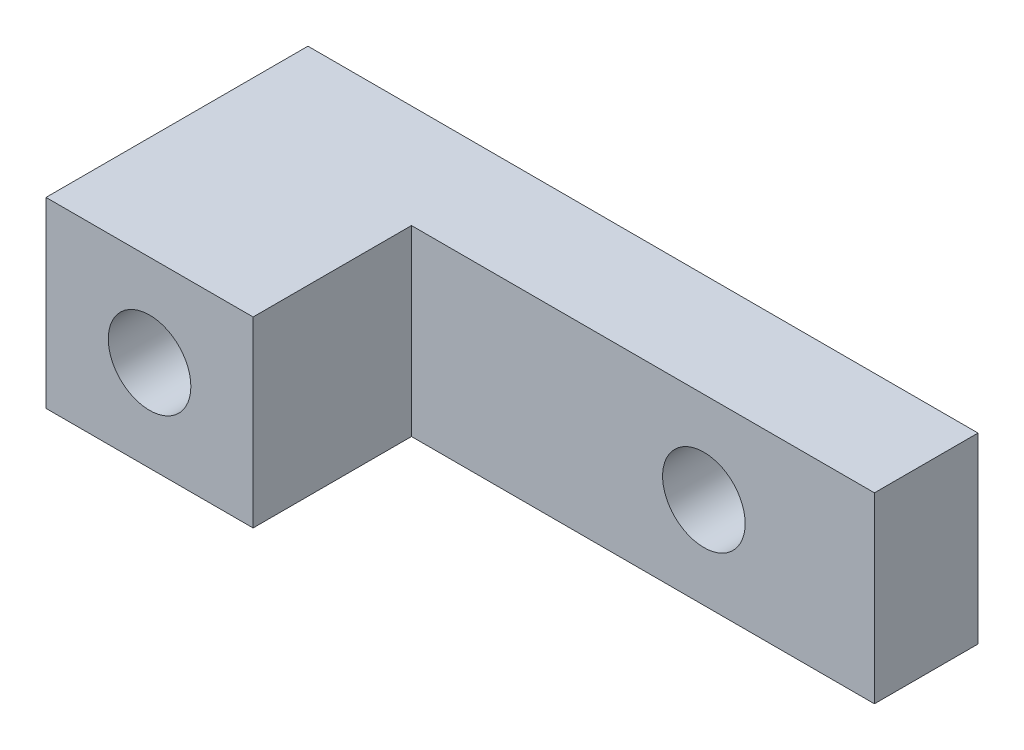
ISO-10303-21;
HEADER;
FILE_DESCRIPTION(('STEP AP214'),'2;1');
FILE_NAME('part.step','',(''),(''),'','','');
FILE_SCHEMA(('AUTOMOTIVE_DESIGN { 1 0 10303 214 1 1 1 1 }'));
ENDSEC;
DATA;
#1=APPLICATION_CONTEXT('core data for automotive mechanical design processes');
#2=APPLICATION_PROTOCOL_DEFINITION('international standard','automotive_design',2000,#1);
#3=PRODUCT_CONTEXT('',#1,'mechanical');
#4=PRODUCT('Part','Part','',(#3));
#5=PRODUCT_RELATED_PRODUCT_CATEGORY('part','',(#4));
#6=PRODUCT_DEFINITION_FORMATION('','',#4);
#7=PRODUCT_DEFINITION_CONTEXT('part definition',#1,'design');
#8=PRODUCT_DEFINITION('design','',#6,#7);
#9=PRODUCT_DEFINITION_SHAPE('','',#8);
#10=(LENGTH_UNIT() NAMED_UNIT(*) SI_UNIT(.MILLI.,.METRE.));
#11=(NAMED_UNIT(*) PLANE_ANGLE_UNIT() SI_UNIT($,.RADIAN.));
#12=(NAMED_UNIT(*) SI_UNIT($,.STERADIAN.) SOLID_ANGLE_UNIT());
#13=UNCERTAINTY_MEASURE_WITH_UNIT(LENGTH_MEASURE(1.E-05),#10,'distance_accuracy_value','');
#14=(GEOMETRIC_REPRESENTATION_CONTEXT(3) GLOBAL_UNCERTAINTY_ASSIGNED_CONTEXT((#13)) GLOBAL_UNIT_ASSIGNED_CONTEXT((#10,
#11,#12)) REPRESENTATION_CONTEXT('',''));
#15=CARTESIAN_POINT('',(0.,0.,0.));
#16=DIRECTION('',(0.,0.,1.));
#17=DIRECTION('',(1.,0.,0.));
#18=AXIS2_PLACEMENT_3D('',#15,#16,#17);
#19=CARTESIAN_POINT('',(-10.795,4.7625,0.));
#20=DIRECTION('',(0.,0.,-1.));
#21=DIRECTION('',(-1.,0.,0.));
#22=AXIS2_PLACEMENT_3D('',#19,#20,#21);
#23=PLANE('',#22);
#24=CARTESIAN_POINT('',(-5.3975,0.,0.));
#25=DIRECTION('',(0.,0.,1.));
#26=DIRECTION('',(1.,0.,0.));
#27=AXIS2_PLACEMENT_3D('',#24,#25,#26);
#28=CIRCLE('',#27,2.15265);
#29=CARTESIAN_POINT('',(-3.24485,0.,0.));
#30=VERTEX_POINT('',#29);
#31=EDGE_CURVE('E162',#30,#30,#28,.T.);
#32=ORIENTED_EDGE('',*,*,#31,.F.);
#33=EDGE_LOOP('',(#32));
#34=FACE_BOUND('',#33,.T.);
#35=DIRECTION('',(1.,0.,0.));
#36=VECTOR('',#35,1.);
#37=CARTESIAN_POINT('',(-10.795,-4.7625,0.));
#38=LINE('',#37,#36);
#39=CARTESIAN_POINT('',(-10.795,-4.7625,0.));
#40=VERTEX_POINT('',#39);
#41=CARTESIAN_POINT('',(0.,-4.7625,0.));
#42=VERTEX_POINT('',#41);
#43=EDGE_CURVE('E119',#40,#42,#38,.T.);
#44=ORIENTED_EDGE('',*,*,#43,.T.);
#45=DIRECTION('',(0.,-1.,0.));
#46=VECTOR('',#45,1.);
#47=CARTESIAN_POINT('',(0.,4.7625,0.));
#48=LINE('',#47,#46);
#49=CARTESIAN_POINT('',(0.,4.7625,0.));
#50=VERTEX_POINT('',#49);
#51=EDGE_CURVE('E11',#50,#42,#48,.T.);
#52=ORIENTED_EDGE('',*,*,#51,.F.);
#53=DIRECTION('',(1.,0.,0.));
#54=VECTOR('',#53,1.);
#55=CARTESIAN_POINT('',(-10.795,4.7625,0.));
#56=LINE('',#55,#54);
#57=CARTESIAN_POINT('',(-10.795,4.7625,0.));
#58=VERTEX_POINT('',#57);
#59=EDGE_CURVE('E130',#58,#50,#56,.T.);
#60=ORIENTED_EDGE('',*,*,#59,.F.);
#61=DIRECTION('',(0.,-1.,0.));
#62=VECTOR('',#61,1.);
#63=CARTESIAN_POINT('',(-10.795,4.7625,0.));
#64=LINE('',#63,#62);
#65=EDGE_CURVE('E115',#58,#40,#64,.T.);
#66=ORIENTED_EDGE('',*,*,#65,.T.);
#67=EDGE_LOOP('',(#44,#52,#60,#66));
#68=FACE_BOUND('',#67,.T.);
#69=ADVANCED_FACE('F35',(#34,#68),#23,.F.);
#70=CARTESIAN_POINT('',(0.,4.7625,0.));
#71=DIRECTION('',(-1.,0.,0.));
#72=DIRECTION('',(0.,0.,1.));
#73=AXIS2_PLACEMENT_3D('',#70,#71,#72);
#74=PLANE('',#73);
#75=DIRECTION('',(0.,0.,-1.));
#76=VECTOR('',#75,1.);
#77=CARTESIAN_POINT('',(0.,-4.7625,0.));
#78=LINE('',#77,#76);
#79=CARTESIAN_POINT('',(0.,-4.7625,-8.25500000000001));
#80=VERTEX_POINT('',#79);
#81=EDGE_CURVE('E122',#42,#80,#78,.T.);
#82=ORIENTED_EDGE('',*,*,#81,.T.);
#83=DIRECTION('',(0.,-1.,0.));
#84=VECTOR('',#83,1.);
#85=CARTESIAN_POINT('',(0.,4.7625,-8.25500000000001));
#86=LINE('',#85,#84);
#87=CARTESIAN_POINT('',(0.,4.7625,-8.25500000000001));
#88=VERTEX_POINT('',#87);
#89=EDGE_CURVE('E43',#88,#80,#86,.T.);
#90=ORIENTED_EDGE('',*,*,#89,.F.);
#91=DIRECTION('',(0.,0.,-1.));
#92=VECTOR('',#91,1.);
#93=CARTESIAN_POINT('',(0.,4.7625,0.));
#94=LINE('',#93,#92);
#95=EDGE_CURVE('E88',#50,#88,#94,.T.);
#96=ORIENTED_EDGE('',*,*,#95,.F.);
#97=ORIENTED_EDGE('',*,*,#51,.T.);
#98=EDGE_LOOP('',(#82,#90,#96,#97));
#99=FACE_BOUND('',#98,.T.);
#100=ADVANCED_FACE('F155',(#99),#74,.F.);
#101=CARTESIAN_POINT('',(0.,4.7625,-8.25500000000001));
#102=DIRECTION('',(0.,0.,-1.));
#103=DIRECTION('',(-1.,0.,0.));
#104=AXIS2_PLACEMENT_3D('',#101,#102,#103);
#105=PLANE('',#104);
#106=CARTESIAN_POINT('',(15.24,0.,-8.25500000000001));
#107=DIRECTION('',(0.,0.,-1.));
#108=DIRECTION('',(-1.,0.,0.));
#109=AXIS2_PLACEMENT_3D('',#106,#107,#108);
#110=CIRCLE('',#109,2.15265);
#111=CARTESIAN_POINT('',(17.39265,0.,-8.25500000000001));
#112=VERTEX_POINT('',#111);
#113=EDGE_CURVE('E123',#112,#112,#110,.T.);
#114=ORIENTED_EDGE('',*,*,#113,.T.);
#115=EDGE_LOOP('',(#114));
#116=FACE_BOUND('',#115,.T.);
#117=DIRECTION('',(1.,0.,0.));
#118=VECTOR('',#117,1.);
#119=CARTESIAN_POINT('',(0.,-4.7625,-8.25500000000001));
#120=LINE('',#119,#118);
#121=CARTESIAN_POINT('',(24.13,-4.7625,-8.255));
#122=VERTEX_POINT('',#121);
#123=EDGE_CURVE('E125',#80,#122,#120,.T.);
#124=ORIENTED_EDGE('',*,*,#123,.T.);
#125=DIRECTION('',(0.,-1.,0.));
#126=VECTOR('',#125,1.);
#127=CARTESIAN_POINT('',(24.13,4.7625,-8.255));
#128=LINE('',#127,#126);
#129=CARTESIAN_POINT('',(24.13,4.7625,-8.255));
#130=VERTEX_POINT('',#129);
#131=EDGE_CURVE('E110',#130,#122,#128,.T.);
#132=ORIENTED_EDGE('',*,*,#131,.F.);
#133=DIRECTION('',(1.,0.,0.));
#134=VECTOR('',#133,1.);
#135=CARTESIAN_POINT('',(0.,4.7625,-8.25500000000001));
#136=LINE('',#135,#134);
#137=EDGE_CURVE('E101',#88,#130,#136,.T.);
#138=ORIENTED_EDGE('',*,*,#137,.F.);
#139=ORIENTED_EDGE('',*,*,#89,.T.);
#140=EDGE_LOOP('',(#124,#132,#138,#139));
#141=FACE_BOUND('',#140,.T.);
#142=ADVANCED_FACE('F136',(#116,#141),#105,.F.);
#143=CARTESIAN_POINT('',(24.13,4.7625,-8.255));
#144=DIRECTION('',(-1.,0.,0.));
#145=DIRECTION('',(0.,0.,1.));
#146=AXIS2_PLACEMENT_3D('',#143,#144,#145);
#147=PLANE('',#146);
#148=DIRECTION('',(0.,0.,-1.));
#149=VECTOR('',#148,1.);
#150=CARTESIAN_POINT('',(24.13,-4.7625,-8.255));
#151=LINE('',#150,#149);
#152=CARTESIAN_POINT('',(24.13,-4.7625,-13.6525));
#153=VERTEX_POINT('',#152);
#154=EDGE_CURVE('E109',#122,#153,#151,.T.);
#155=ORIENTED_EDGE('',*,*,#154,.T.);
#156=DIRECTION('',(0.,-1.,0.));
#157=VECTOR('',#156,1.);
#158=CARTESIAN_POINT('',(24.13,4.7625,-13.6525));
#159=LINE('',#158,#157);
#160=CARTESIAN_POINT('',(24.13,4.7625,-13.6525));
#161=VERTEX_POINT('',#160);
#162=EDGE_CURVE('E106',#161,#153,#159,.T.);
#163=ORIENTED_EDGE('',*,*,#162,.F.);
#164=DIRECTION('',(0.,0.,-1.));
#165=VECTOR('',#164,1.);
#166=CARTESIAN_POINT('',(24.13,4.7625,-8.255));
#167=LINE('',#166,#165);
#168=EDGE_CURVE('E95',#130,#161,#167,.T.);
#169=ORIENTED_EDGE('',*,*,#168,.F.);
#170=ORIENTED_EDGE('',*,*,#131,.T.);
#171=EDGE_LOOP('',(#155,#163,#169,#170));
#172=FACE_BOUND('',#171,.T.);
#173=ADVANCED_FACE('F107',(#172),#147,.F.);
#174=CARTESIAN_POINT('',(24.13,4.7625,-13.6525));
#175=DIRECTION('',(0.,0.,1.));
#176=DIRECTION('',(1.,0.,0.));
#177=AXIS2_PLACEMENT_3D('',#174,#175,#176);
#178=PLANE('',#177);
#179=CARTESIAN_POINT('',(-5.3975,0.,-13.6525));
#180=DIRECTION('',(0.,0.,1.));
#181=DIRECTION('',(1.,0.,0.));
#182=AXIS2_PLACEMENT_3D('',#179,#180,#181);
#183=CIRCLE('',#182,2.15265);
#184=CARTESIAN_POINT('',(-3.24485,0.,-13.6525));
#185=VERTEX_POINT('',#184);
#186=EDGE_CURVE('E164',#185,#185,#183,.T.);
#187=ORIENTED_EDGE('',*,*,#186,.T.);
#188=EDGE_LOOP('',(#187));
#189=FACE_BOUND('',#188,.T.);
#190=CARTESIAN_POINT('',(15.24,0.,-13.6525));
#191=DIRECTION('',(0.,0.,1.));
#192=DIRECTION('',(1.,0.,0.));
#193=AXIS2_PLACEMENT_3D('',#190,#191,#192);
#194=CIRCLE('',#193,2.15265);
#195=CARTESIAN_POINT('',(17.39265,0.,-13.6525));
#196=VERTEX_POINT('',#195);
#197=EDGE_CURVE('E167',#196,#196,#194,.T.);
#198=ORIENTED_EDGE('',*,*,#197,.T.);
#199=EDGE_LOOP('',(#198));
#200=FACE_BOUND('',#199,.T.);
#201=DIRECTION('',(-1.,0.,0.));
#202=VECTOR('',#201,1.);
#203=CARTESIAN_POINT('',(24.13,-4.7625,-13.6525));
#204=LINE('',#203,#202);
#205=CARTESIAN_POINT('',(-10.795,-4.7625,-13.6525));
#206=VERTEX_POINT('',#205);
#207=EDGE_CURVE('E74',#153,#206,#204,.T.);
#208=ORIENTED_EDGE('',*,*,#207,.T.);
#209=DIRECTION('',(0.,-1.,0.));
#210=VECTOR('',#209,1.);
#211=CARTESIAN_POINT('',(-10.795,4.7625,-13.6525));
#212=LINE('',#211,#210);
#213=CARTESIAN_POINT('',(-10.795,4.7625,-13.6525));
#214=VERTEX_POINT('',#213);
#215=EDGE_CURVE('E111',#214,#206,#212,.T.);
#216=ORIENTED_EDGE('',*,*,#215,.F.);
#217=DIRECTION('',(-1.,0.,0.));
#218=VECTOR('',#217,1.);
#219=CARTESIAN_POINT('',(24.13,4.7625,-13.6525));
#220=LINE('',#219,#218);
#221=EDGE_CURVE('E99',#161,#214,#220,.T.);
#222=ORIENTED_EDGE('',*,*,#221,.F.);
#223=ORIENTED_EDGE('',*,*,#162,.T.);
#224=EDGE_LOOP('',(#208,#216,#222,#223));
#225=FACE_BOUND('',#224,.T.);
#226=ADVANCED_FACE('F113',(#189,#200,#225),#178,.F.);
#227=CARTESIAN_POINT('',(-10.795,4.7625,-13.6525));
#228=DIRECTION('',(1.,0.,0.));
#229=DIRECTION('',(0.,0.,-1.));
#230=AXIS2_PLACEMENT_3D('',#227,#228,#229);
#231=PLANE('',#230);
#232=DIRECTION('',(0.,0.,1.));
#233=VECTOR('',#232,1.);
#234=CARTESIAN_POINT('',(-10.795,-4.7625,-13.6525));
#235=LINE('',#234,#233);
#236=EDGE_CURVE('E80',#206,#40,#235,.T.);
#237=ORIENTED_EDGE('',*,*,#236,.T.);
#238=ORIENTED_EDGE('',*,*,#65,.F.);
#239=DIRECTION('',(0.,0.,1.));
#240=VECTOR('',#239,1.);
#241=CARTESIAN_POINT('',(-10.795,4.7625,-13.6525));
#242=LINE('',#241,#240);
#243=EDGE_CURVE('E51',#214,#58,#242,.T.);
#244=ORIENTED_EDGE('',*,*,#243,.F.);
#245=ORIENTED_EDGE('',*,*,#215,.T.);
#246=EDGE_LOOP('',(#237,#238,#244,#245));
#247=FACE_BOUND('',#246,.T.);
#248=ADVANCED_FACE('F143',(#247),#231,.F.);
#249=CARTESIAN_POINT('',(0.,4.7625,0.));
#250=DIRECTION('',(0.,1.,0.));
#251=DIRECTION('',(0.,0.,1.));
#252=AXIS2_PLACEMENT_3D('',#249,#250,#251);
#253=PLANE('',#252);
#254=ORIENTED_EDGE('',*,*,#59,.T.);
#255=ORIENTED_EDGE('',*,*,#95,.T.);
#256=ORIENTED_EDGE('',*,*,#137,.T.);
#257=ORIENTED_EDGE('',*,*,#168,.T.);
#258=ORIENTED_EDGE('',*,*,#221,.T.);
#259=ORIENTED_EDGE('',*,*,#243,.T.);
#260=EDGE_LOOP('',(#254,#255,#256,#257,#258,#259));
#261=FACE_BOUND('',#260,.T.);
#262=ADVANCED_FACE('F97',(#261),#253,.T.);
#263=CARTESIAN_POINT('',(0.,-4.7625,0.));
#264=DIRECTION('',(0.,1.,0.));
#265=DIRECTION('',(0.,0.,1.));
#266=AXIS2_PLACEMENT_3D('',#263,#264,#265);
#267=PLANE('',#266);
#268=ORIENTED_EDGE('',*,*,#43,.F.);
#269=ORIENTED_EDGE('',*,*,#236,.F.);
#270=ORIENTED_EDGE('',*,*,#207,.F.);
#271=ORIENTED_EDGE('',*,*,#154,.F.);
#272=ORIENTED_EDGE('',*,*,#123,.F.);
#273=ORIENTED_EDGE('',*,*,#81,.F.);
#274=EDGE_LOOP('',(#268,#269,#270,#271,#272,#273));
#275=FACE_BOUND('',#274,.T.);
#276=ADVANCED_FACE('F139',(#275),#267,.F.);
#277=CARTESIAN_POINT('',(15.24,0.,-13.6525));
#278=DIRECTION('',(0.,0.,1.));
#279=DIRECTION('',(1.,0.,0.));
#280=AXIS2_PLACEMENT_3D('',#277,#278,#279);
#281=CYLINDRICAL_SURFACE('',#280,2.15265);
#282=CARTESIAN_POINT('',(17.39265,0.,-13.6525));
#283=CARTESIAN_POINT('',(17.39265,0.,-13.5962760416667));
#284=CARTESIAN_POINT('',(17.39265,0.,-13.5400520833333));
#285=CARTESIAN_POINT('',(17.39265,0.,-13.4276041666667));
#286=CARTESIAN_POINT('',(17.39265,0.,-13.3713802083333));
#287=CARTESIAN_POINT('',(17.39265,0.,-13.2589322916667));
#288=CARTESIAN_POINT('',(17.39265,0.,-13.2027083333333));
#289=CARTESIAN_POINT('',(17.39265,0.,-13.0902604166667));
#290=CARTESIAN_POINT('',(17.39265,0.,-13.0340364583333));
#291=CARTESIAN_POINT('',(17.39265,0.,-12.9215885416667));
#292=CARTESIAN_POINT('',(17.39265,0.,-12.8653645833333));
#293=CARTESIAN_POINT('',(17.39265,0.,-12.7529166666667));
#294=CARTESIAN_POINT('',(17.39265,0.,-12.6966927083333));
#295=CARTESIAN_POINT('',(17.39265,0.,-12.5842447916667));
#296=CARTESIAN_POINT('',(17.39265,0.,-12.5280208333333));
#297=CARTESIAN_POINT('',(17.39265,0.,-12.4155729166667));
#298=CARTESIAN_POINT('',(17.39265,0.,-12.3593489583333));
#299=CARTESIAN_POINT('',(17.39265,0.,-12.2469010416667));
#300=CARTESIAN_POINT('',(17.39265,0.,-12.1906770833333));
#301=CARTESIAN_POINT('',(17.39265,0.,-12.0782291666667));
#302=CARTESIAN_POINT('',(17.39265,0.,-12.0220052083333));
#303=CARTESIAN_POINT('',(17.39265,0.,-11.9095572916667));
#304=CARTESIAN_POINT('',(17.39265,0.,-11.8533333333333));
#305=CARTESIAN_POINT('',(17.39265,0.,-11.7408854166667));
#306=CARTESIAN_POINT('',(17.39265,0.,-11.6846614583333));
#307=CARTESIAN_POINT('',(17.39265,0.,-11.5722135416667));
#308=CARTESIAN_POINT('',(17.39265,0.,-11.5159895833333));
#309=CARTESIAN_POINT('',(17.39265,0.,-11.4035416666667));
#310=CARTESIAN_POINT('',(17.39265,0.,-11.3473177083333));
#311=CARTESIAN_POINT('',(17.39265,0.,-11.2348697916667));
#312=CARTESIAN_POINT('',(17.39265,0.,-11.1786458333333));
#313=CARTESIAN_POINT('',(17.39265,0.,-11.0661979166667));
#314=CARTESIAN_POINT('',(17.39265,0.,-11.0099739583333));
#315=CARTESIAN_POINT('',(17.39265,0.,-10.8975260416667));
#316=CARTESIAN_POINT('',(17.39265,0.,-10.8413020833333));
#317=CARTESIAN_POINT('',(17.39265,0.,-10.7288541666667));
#318=CARTESIAN_POINT('',(17.39265,0.,-10.6726302083333));
#319=CARTESIAN_POINT('',(17.39265,0.,-10.5601822916667));
#320=CARTESIAN_POINT('',(17.39265,0.,-10.5039583333333));
#321=CARTESIAN_POINT('',(17.39265,0.,-10.3915104166667));
#322=CARTESIAN_POINT('',(17.39265,0.,-10.3352864583333));
#323=CARTESIAN_POINT('',(17.39265,0.,-10.2228385416667));
#324=CARTESIAN_POINT('',(17.39265,0.,-10.1666145833333));
#325=CARTESIAN_POINT('',(17.39265,0.,-10.0541666666667));
#326=CARTESIAN_POINT('',(17.39265,0.,-9.99794270833334));
#327=CARTESIAN_POINT('',(17.39265,0.,-9.88549479166667));
#328=CARTESIAN_POINT('',(17.39265,0.,-9.82927083333334));
#329=CARTESIAN_POINT('',(17.39265,0.,-9.71682291666667));
#330=CARTESIAN_POINT('',(17.39265,0.,-9.66059895833334));
#331=CARTESIAN_POINT('',(17.39265,0.,-9.54815104166667));
#332=CARTESIAN_POINT('',(17.39265,0.,-9.49192708333334));
#333=CARTESIAN_POINT('',(17.39265,0.,-9.37947916666667));
#334=CARTESIAN_POINT('',(17.39265,0.,-9.32325520833334));
#335=CARTESIAN_POINT('',(17.39265,0.,-9.21080729166667));
#336=CARTESIAN_POINT('',(17.39265,0.,-9.15458333333334));
#337=CARTESIAN_POINT('',(17.39265,0.,-9.04213541666667));
#338=CARTESIAN_POINT('',(17.39265,0.,-8.98591145833334));
#339=CARTESIAN_POINT('',(17.39265,0.,-8.87346354166667));
#340=CARTESIAN_POINT('',(17.39265,0.,-8.81723958333334));
#341=CARTESIAN_POINT('',(17.39265,0.,-8.70479166666667));
#342=CARTESIAN_POINT('',(17.39265,0.,-8.64856770833334));
#343=CARTESIAN_POINT('',(17.39265,0.,-8.53611979166667));
#344=CARTESIAN_POINT('',(17.39265,0.,-8.47989583333334));
#345=CARTESIAN_POINT('',(17.39265,0.,-8.36744791666667));
#346=CARTESIAN_POINT('',(17.39265,0.,-8.31122395833334));
#347=CARTESIAN_POINT('',(17.39265,0.,-8.25500000000001));
#348=B_SPLINE_CURVE_WITH_KNOTS('',3,(#282,#283,#284,#285,#286,#287,#288,#289,#290,#291,#292,
#293,#294,#295,#296,#297,#298,#299,#300,#301,#302,#303,#304,#305,#306,#307,#308,#309,#310,#311,
#312,#313,#314,#315,#316,#317,#318,#319,#320,#321,#322,#323,#324,#325,#326,#327,#328,#329,#330,
#331,#332,#333,#334,#335,#336,#337,#338,#339,#340,#341,#342,#343,#344,#345,#346,#347),
.UNSPECIFIED.,.F.,.F.,(4,2,2,2,2,2,2,2,2,2,2,2,2,2,2,2,2,2,2,2,2,2,2,2,2,2,2,2,2,2,2,2,4),(0.,
0.168671874999998,0.337343749999998,0.506015624999998,0.674687499999998,0.843359374999998,
1.01203125,1.180703125,1.349375,1.518046875,1.68671875,1.855390625,2.0240625,2.192734375,
2.36140625,2.530078125,2.69874999999999,2.867421875,3.03609374999999,3.20476562499999,
3.37343749999999,3.54210937499999,3.71078124999999,3.87945312499999,4.04812499999999,
4.21679687499999,4.38546874999999,4.55414062499999,4.72281249999999,4.89148437499999,
5.06015624999999,5.22882812499999,5.39749999999999),.UNSPECIFIED.);
#349=EDGE_CURVE('BSEAM178',#196,#112,#348,.T.);
#350=ORIENTED_EDGE('',*,*,#197,.F.);
#351=ORIENTED_EDGE('',*,*,#113,.F.);
#352=ORIENTED_EDGE('',*,*,#349,.T.);
#353=ORIENTED_EDGE('',*,*,#349,.F.);
#354=EDGE_LOOP('',(#350,#352,#351,#353));
#355=FACE_BOUND('',#354,.T.);
#356=ADVANCED_FACE('F178',(#355),#281,.F.);
#357=CARTESIAN_POINT('',(-5.3975,0.,-13.6525));
#358=DIRECTION('',(0.,0.,1.));
#359=DIRECTION('',(1.,0.,0.));
#360=AXIS2_PLACEMENT_3D('',#357,#358,#359);
#361=CYLINDRICAL_SURFACE('',#360,2.15265);
#362=CARTESIAN_POINT('',(-3.24485,0.,-13.6525));
#363=CARTESIAN_POINT('',(-3.24485,0.,-13.5102864583333));
#364=CARTESIAN_POINT('',(-3.24485,0.,-13.3680729166667));
#365=CARTESIAN_POINT('',(-3.24485,0.,-13.0836458333333));
#366=CARTESIAN_POINT('',(-3.24485,0.,-12.9414322916667));
#367=CARTESIAN_POINT('',(-3.24485,0.,-12.6570052083333));
#368=CARTESIAN_POINT('',(-3.24485,0.,-12.5147916666667));
#369=CARTESIAN_POINT('',(-3.24485,0.,-12.2303645833333));
#370=CARTESIAN_POINT('',(-3.24485,0.,-12.0881510416667));
#371=CARTESIAN_POINT('',(-3.24485,0.,-11.8037239583333));
#372=CARTESIAN_POINT('',(-3.24485,0.,-11.6615104166667));
#373=CARTESIAN_POINT('',(-3.24485,0.,-11.3770833333333));
#374=CARTESIAN_POINT('',(-3.24485,0.,-11.2348697916667));
#375=CARTESIAN_POINT('',(-3.24485,0.,-10.9504427083333));
#376=CARTESIAN_POINT('',(-3.24485,0.,-10.8082291666667));
#377=CARTESIAN_POINT('',(-3.24485,0.,-10.5238020833333));
#378=CARTESIAN_POINT('',(-3.24485,0.,-10.3815885416667));
#379=CARTESIAN_POINT('',(-3.24485,0.,-10.0971614583333));
#380=CARTESIAN_POINT('',(-3.24485,0.,-9.95494791666667));
#381=CARTESIAN_POINT('',(-3.24485,0.,-9.67052083333333));
#382=CARTESIAN_POINT('',(-3.24485,0.,-9.52830729166666));
#383=CARTESIAN_POINT('',(-3.24485,0.,-9.24388020833333));
#384=CARTESIAN_POINT('',(-3.24485,0.,-9.10166666666667));
#385=CARTESIAN_POINT('',(-3.24485,0.,-8.81723958333333));
#386=CARTESIAN_POINT('',(-3.24485,0.,-8.67502604166667));
#387=CARTESIAN_POINT('',(-3.24485,0.,-8.39059895833333));
#388=CARTESIAN_POINT('',(-3.24485,0.,-8.24838541666666));
#389=CARTESIAN_POINT('',(-3.24485,0.,-7.96395833333333));
#390=CARTESIAN_POINT('',(-3.24485,0.,-7.82174479166666));
#391=CARTESIAN_POINT('',(-3.24485,0.,-7.53731770833333));
#392=CARTESIAN_POINT('',(-3.24485,0.,-7.39510416666667));
#393=CARTESIAN_POINT('',(-3.24485,0.,-7.11067708333333));
#394=CARTESIAN_POINT('',(-3.24485,0.,-6.96846354166667));
#395=CARTESIAN_POINT('',(-3.24485,0.,-6.68403645833333));
#396=CARTESIAN_POINT('',(-3.24485,0.,-6.54182291666667));
#397=CARTESIAN_POINT('',(-3.24485,0.,-6.25739583333333));
#398=CARTESIAN_POINT('',(-3.24485,0.,-6.11518229166667));
#399=CARTESIAN_POINT('',(-3.24485,0.,-5.83075520833333));
#400=CARTESIAN_POINT('',(-3.24485,0.,-5.68854166666667));
#401=CARTESIAN_POINT('',(-3.24485,0.,-5.40411458333333));
#402=CARTESIAN_POINT('',(-3.24485,0.,-5.26190104166667));
#403=CARTESIAN_POINT('',(-3.24485,0.,-4.97747395833333));
#404=CARTESIAN_POINT('',(-3.24485,0.,-4.83526041666667));
#405=CARTESIAN_POINT('',(-3.24485,0.,-4.55083333333333));
#406=CARTESIAN_POINT('',(-3.24485,0.,-4.40861979166667));
#407=CARTESIAN_POINT('',(-3.24485,0.,-4.12419270833333));
#408=CARTESIAN_POINT('',(-3.24485,0.,-3.98197916666667));
#409=CARTESIAN_POINT('',(-3.24485,0.,-3.69755208333333));
#410=CARTESIAN_POINT('',(-3.24485,0.,-3.55533854166667));
#411=CARTESIAN_POINT('',(-3.24485,0.,-3.27091145833333));
#412=CARTESIAN_POINT('',(-3.24485,0.,-3.12869791666667));
#413=CARTESIAN_POINT('',(-3.24485,0.,-2.84427083333333));
#414=CARTESIAN_POINT('',(-3.24485,0.,-2.70205729166667));
#415=CARTESIAN_POINT('',(-3.24485,0.,-2.41763020833333));
#416=CARTESIAN_POINT('',(-3.24485,0.,-2.27541666666667));
#417=CARTESIAN_POINT('',(-3.24485,0.,-1.99098958333333));
#418=CARTESIAN_POINT('',(-3.24485,0.,-1.84877604166667));
#419=CARTESIAN_POINT('',(-3.24485,0.,-1.56434895833333));
#420=CARTESIAN_POINT('',(-3.24485,0.,-1.42213541666667));
#421=CARTESIAN_POINT('',(-3.24485,0.,-1.13770833333333));
#422=CARTESIAN_POINT('',(-3.24485,0.,-0.995494791666667));
#423=CARTESIAN_POINT('',(-3.24485,0.,-0.711067708333334));
#424=CARTESIAN_POINT('',(-3.24485,0.,-0.568854166666667));
#425=CARTESIAN_POINT('',(-3.24485,0.,-0.284427083333334));
#426=CARTESIAN_POINT('',(-3.24485,0.,-0.142213541666667));
#427=CARTESIAN_POINT('',(-3.24485,0.,0.));
#428=B_SPLINE_CURVE_WITH_KNOTS('',3,(#362,#363,#364,#365,#366,#367,#368,#369,#370,#371,#372,
#373,#374,#375,#376,#377,#378,#379,#380,#381,#382,#383,#384,#385,#386,#387,#388,#389,#390,#391,
#392,#393,#394,#395,#396,#397,#398,#399,#400,#401,#402,#403,#404,#405,#406,#407,#408,#409,#410,
#411,#412,#413,#414,#415,#416,#417,#418,#419,#420,#421,#422,#423,#424,#425,#426,#427),
.UNSPECIFIED.,.F.,.F.,(4,2,2,2,2,2,2,2,2,2,2,2,2,2,2,2,2,2,2,2,2,2,2,2,2,2,2,2,2,2,2,2,4),(0.,
0.426640624999999,0.853281249999999,1.279921875,1.7065625,2.133203125,2.55984375,2.986484375,
3.413125,3.839765625,4.26640625,4.693046875,5.1196875,5.546328125,5.97296875,6.399609375,
6.82625,7.252890625,7.67953125,8.106171875,8.5328125,8.959453125,9.38609375,9.812734375,
10.239375,10.666015625,11.09265625,11.519296875,11.9459375,12.372578125,12.79921875,
13.225859375,13.6525),.UNSPECIFIED.);
#429=EDGE_CURVE('BSEAM180',#185,#30,#428,.T.);
#430=ORIENTED_EDGE('',*,*,#186,.F.);
#431=ORIENTED_EDGE('',*,*,#31,.T.);
#432=ORIENTED_EDGE('',*,*,#429,.T.);
#433=ORIENTED_EDGE('',*,*,#429,.F.);
#434=EDGE_LOOP('',(#430,#432,#431,#433));
#435=FACE_BOUND('',#434,.T.);
#436=ADVANCED_FACE('F180',(#435),#361,.F.);
#437=CLOSED_SHELL('',(#69,#100,#142,#173,#226,#248,#262,#276,#356,#436));
#438=MANIFOLD_SOLID_BREP('B2',#437);
#439=ADVANCED_BREP_SHAPE_REPRESENTATION('',(#18,#438),#14);
#440=SHAPE_DEFINITION_REPRESENTATION(#9,#439);
ENDSEC;
END-ISO-10303-21;
